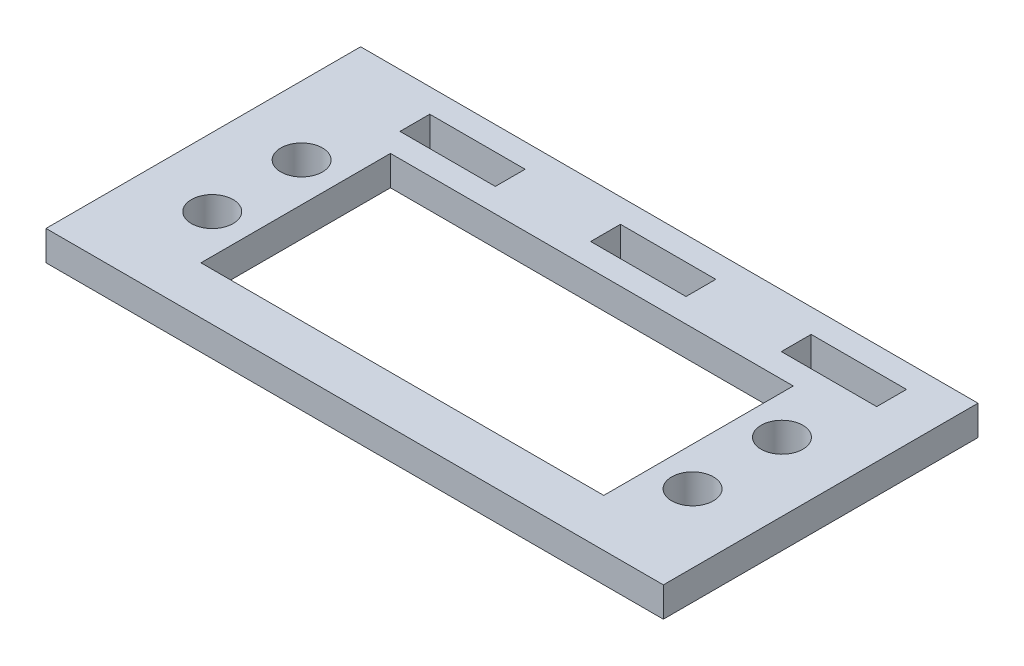
ISO-10303-21;
HEADER;
FILE_DESCRIPTION(('STEP AP214'),'2;1');
FILE_NAME('part.step','',(''),(''),'','','');
FILE_SCHEMA(('AUTOMOTIVE_DESIGN { 1 0 10303 214 1 1 1 1 }'));
ENDSEC;
DATA;
#1=APPLICATION_CONTEXT('core data for automotive mechanical design processes');
#2=APPLICATION_PROTOCOL_DEFINITION('international standard','automotive_design',2000,#1);
#3=PRODUCT_CONTEXT('',#1,'mechanical');
#4=PRODUCT('Part','Part','',(#3));
#5=PRODUCT_RELATED_PRODUCT_CATEGORY('part','',(#4));
#6=PRODUCT_DEFINITION_FORMATION('','',#4);
#7=PRODUCT_DEFINITION_CONTEXT('part definition',#1,'design');
#8=PRODUCT_DEFINITION('design','',#6,#7);
#9=PRODUCT_DEFINITION_SHAPE('','',#8);
#10=(LENGTH_UNIT() NAMED_UNIT(*) SI_UNIT(.MILLI.,.METRE.));
#11=(NAMED_UNIT(*) PLANE_ANGLE_UNIT() SI_UNIT($,.RADIAN.));
#12=(NAMED_UNIT(*) SI_UNIT($,.STERADIAN.) SOLID_ANGLE_UNIT());
#13=UNCERTAINTY_MEASURE_WITH_UNIT(LENGTH_MEASURE(1.E-05),#10,'distance_accuracy_value','');
#14=(GEOMETRIC_REPRESENTATION_CONTEXT(3) GLOBAL_UNCERTAINTY_ASSIGNED_CONTEXT((#13)) GLOBAL_UNIT_ASSIGNED_CONTEXT((#10,
#11,#12)) REPRESENTATION_CONTEXT('',''));
#15=CARTESIAN_POINT('',(0.,0.,0.));
#16=DIRECTION('',(0.,0.,1.));
#17=DIRECTION('',(1.,0.,0.));
#18=AXIS2_PLACEMENT_3D('',#15,#16,#17);
#19=CARTESIAN_POINT('',(32.893,3.175,15.1765));
#20=DIRECTION('',(0.,-1.,0.));
#21=DIRECTION('',(0.,0.,-1.));
#22=AXIS2_PLACEMENT_3D('',#19,#20,#21);
#23=PLANE('',#22);
#24=DIRECTION('',(0.,0.,1.));
#25=VECTOR('',#24,1.);
#26=CARTESIAN_POINT('',(-22.987,3.175,-15.8114999999997));
#27=LINE('',#26,#25);
#28=CARTESIAN_POINT('',(-22.987,3.175,-15.8114999999997));
#29=VERTEX_POINT('',#28);
#30=CARTESIAN_POINT('',(-22.987,3.175,-12.6364999999997));
#31=VERTEX_POINT('',#30);
#32=EDGE_CURVE('E211',#29,#31,#27,.T.);
#33=ORIENTED_EDGE('',*,*,#32,.F.);
#34=DIRECTION('',(-1.,0.,0.));
#35=VECTOR('',#34,1.);
#36=CARTESIAN_POINT('',(-12.827,3.175,-15.8114999999997));
#37=LINE('',#36,#35);
#38=CARTESIAN_POINT('',(-12.827,3.175,-15.8114999999997));
#39=VERTEX_POINT('',#38);
#40=EDGE_CURVE('E219',#39,#29,#37,.T.);
#41=ORIENTED_EDGE('',*,*,#40,.F.);
#42=DIRECTION('',(0.,0.,-1.));
#43=VECTOR('',#42,1.);
#44=CARTESIAN_POINT('',(-12.827,3.175,-15.8114999999997));
#45=LINE('',#44,#43);
#46=CARTESIAN_POINT('',(-12.827,3.175,-12.6364999999997));
#47=VERTEX_POINT('',#46);
#48=EDGE_CURVE('E216',#47,#39,#45,.T.);
#49=ORIENTED_EDGE('',*,*,#48,.F.);
#50=DIRECTION('',(1.,0.,0.));
#51=VECTOR('',#50,1.);
#52=CARTESIAN_POINT('',(-12.827,3.175,-12.6364999999997));
#53=LINE('',#52,#51);
#54=EDGE_CURVE('E213',#31,#47,#53,.T.);
#55=ORIENTED_EDGE('',*,*,#54,.F.);
#56=EDGE_LOOP('',(#33,#41,#49,#55));
#57=FACE_BOUND('',#56,.T.);
#58=DIRECTION('',(0.,0.,1.));
#59=VECTOR('',#58,1.);
#60=CARTESIAN_POINT('',(17.653,3.175,-15.8115));
#61=LINE('',#60,#59);
#62=CARTESIAN_POINT('',(17.653,3.175,-15.8115));
#63=VERTEX_POINT('',#62);
#64=CARTESIAN_POINT('',(17.653,3.175,-12.6365));
#65=VERTEX_POINT('',#64);
#66=EDGE_CURVE('E273',#63,#65,#61,.T.);
#67=ORIENTED_EDGE('',*,*,#66,.F.);
#68=DIRECTION('',(-1.,0.,0.));
#69=VECTOR('',#68,1.);
#70=CARTESIAN_POINT('',(27.813,3.175,-15.8115));
#71=LINE('',#70,#69);
#72=CARTESIAN_POINT('',(27.813,3.175,-15.8115));
#73=VERTEX_POINT('',#72);
#74=EDGE_CURVE('E281',#73,#63,#71,.T.);
#75=ORIENTED_EDGE('',*,*,#74,.F.);
#76=DIRECTION('',(0.,0.,-1.));
#77=VECTOR('',#76,1.);
#78=CARTESIAN_POINT('',(27.813,3.175,-15.8115));
#79=LINE('',#78,#77);
#80=CARTESIAN_POINT('',(27.813,3.175,-12.6365));
#81=VERTEX_POINT('',#80);
#82=EDGE_CURVE('E278',#81,#73,#79,.T.);
#83=ORIENTED_EDGE('',*,*,#82,.F.);
#84=DIRECTION('',(1.,0.,0.));
#85=VECTOR('',#84,1.);
#86=CARTESIAN_POINT('',(27.813,3.175,-12.6365));
#87=LINE('',#86,#85);
#88=EDGE_CURVE('E275',#65,#81,#87,.T.);
#89=ORIENTED_EDGE('',*,*,#88,.F.);
#90=EDGE_LOOP('',(#67,#75,#83,#89));
#91=FACE_BOUND('',#90,.T.);
#92=DIRECTION('',(0.,0.,-1.));
#93=VECTOR('',#92,1.);
#94=CARTESIAN_POINT('',(32.893,3.175,-18.3515));
#95=LINE('',#94,#93);
#96=CARTESIAN_POINT('',(32.893,3.175,15.1765));
#97=VERTEX_POINT('',#96);
#98=CARTESIAN_POINT('',(32.893,3.175,-18.3515));
#99=VERTEX_POINT('',#98);
#100=EDGE_CURVE('E304',#97,#99,#95,.T.);
#101=ORIENTED_EDGE('',*,*,#100,.T.);
#102=DIRECTION('',(-1.,0.,0.));
#103=VECTOR('',#102,1.);
#104=CARTESIAN_POINT('',(32.893,3.175,-18.3515));
#105=LINE('',#104,#103);
#106=CARTESIAN_POINT('',(-32.893,3.175,-18.3515));
#107=VERTEX_POINT('',#106);
#108=EDGE_CURVE('E307',#99,#107,#105,.T.);
#109=ORIENTED_EDGE('',*,*,#108,.T.);
#110=DIRECTION('',(0.,0.,1.));
#111=VECTOR('',#110,1.);
#112=CARTESIAN_POINT('',(-32.893,3.175,-18.3515));
#113=LINE('',#112,#111);
#114=CARTESIAN_POINT('',(-32.893,3.175,15.1765));
#115=VERTEX_POINT('',#114);
#116=EDGE_CURVE('E310',#107,#115,#113,.T.);
#117=ORIENTED_EDGE('',*,*,#116,.T.);
#118=DIRECTION('',(1.,0.,0.));
#119=VECTOR('',#118,1.);
#120=CARTESIAN_POINT('',(32.893,3.175,15.1765));
#121=LINE('',#120,#119);
#122=EDGE_CURVE('E312',#115,#97,#121,.T.);
#123=ORIENTED_EDGE('',*,*,#122,.T.);
#124=EDGE_LOOP('',(#101,#109,#117,#123));
#125=FACE_BOUND('',#124,.T.);
#126=DIRECTION('',(0.,0.,1.));
#127=VECTOR('',#126,1.);
#128=CARTESIAN_POINT('',(-2.66700000000001,3.175,-15.8114999999999));
#129=LINE('',#128,#127);
#130=CARTESIAN_POINT('',(-2.66700000000001,3.175,-15.8114999999999));
#131=VERTEX_POINT('',#130);
#132=CARTESIAN_POINT('',(-2.66700000000001,3.175,-12.6364999999999));
#133=VERTEX_POINT('',#132);
#134=EDGE_CURVE('E242',#131,#133,#129,.T.);
#135=ORIENTED_EDGE('',*,*,#134,.F.);
#136=DIRECTION('',(-1.,0.,0.));
#137=VECTOR('',#136,1.);
#138=CARTESIAN_POINT('',(7.493,3.175,-15.8114999999999));
#139=LINE('',#138,#137);
#140=CARTESIAN_POINT('',(7.49299999999999,3.175,-15.8114999999999));
#141=VERTEX_POINT('',#140);
#142=EDGE_CURVE('E250',#141,#131,#139,.T.);
#143=ORIENTED_EDGE('',*,*,#142,.F.);
#144=DIRECTION('',(0.,0.,-1.));
#145=VECTOR('',#144,1.);
#146=CARTESIAN_POINT('',(7.493,3.175,-15.8114999999999));
#147=LINE('',#146,#145);
#148=CARTESIAN_POINT('',(7.493,3.175,-12.6364999999999));
#149=VERTEX_POINT('',#148);
#150=EDGE_CURVE('E247',#149,#141,#147,.T.);
#151=ORIENTED_EDGE('',*,*,#150,.F.);
#152=DIRECTION('',(1.,0.,0.));
#153=VECTOR('',#152,1.);
#154=CARTESIAN_POINT('',(7.493,3.175,-12.6364999999999));
#155=LINE('',#154,#153);
#156=EDGE_CURVE('E244',#133,#149,#155,.T.);
#157=ORIENTED_EDGE('',*,*,#156,.F.);
#158=EDGE_LOOP('',(#135,#143,#151,#157));
#159=FACE_BOUND('',#158,.T.);
#160=DIRECTION('',(0.,0.,-1.));
#161=VECTOR('',#160,1.);
#162=CARTESIAN_POINT('',(21.463,3.175,10.0965));
#163=LINE('',#162,#161);
#164=CARTESIAN_POINT('',(21.463,3.175,10.0965));
#165=VERTEX_POINT('',#164);
#166=CARTESIAN_POINT('',(21.463,3.175,-10.0965));
#167=VERTEX_POINT('',#166);
#168=EDGE_CURVE('E172',#165,#167,#163,.T.);
#169=ORIENTED_EDGE('',*,*,#168,.F.);
#170=DIRECTION('',(1.,0.,0.));
#171=VECTOR('',#170,1.);
#172=CARTESIAN_POINT('',(-21.463,3.175,10.0965));
#173=LINE('',#172,#171);
#174=CARTESIAN_POINT('',(-21.463,3.175,10.0965));
#175=VERTEX_POINT('',#174);
#176=EDGE_CURVE('E195',#175,#165,#173,.T.);
#177=ORIENTED_EDGE('',*,*,#176,.F.);
#178=DIRECTION('',(0.,0.,1.));
#179=VECTOR('',#178,1.);
#180=CARTESIAN_POINT('',(-21.463,3.175,10.0965));
#181=LINE('',#180,#179);
#182=CARTESIAN_POINT('',(-21.463,3.175,-10.0965));
#183=VERTEX_POINT('',#182);
#184=EDGE_CURVE('E193',#183,#175,#181,.T.);
#185=ORIENTED_EDGE('',*,*,#184,.F.);
#186=DIRECTION('',(-1.,0.,0.));
#187=VECTOR('',#186,1.);
#188=CARTESIAN_POINT('',(-21.463,3.175,-10.0965));
#189=LINE('',#188,#187);
#190=EDGE_CURVE('E180',#167,#183,#189,.T.);
#191=ORIENTED_EDGE('',*,*,#190,.F.);
#192=EDGE_LOOP('',(#169,#177,#185,#191));
#193=FACE_BOUND('',#192,.T.);
#194=CARTESIAN_POINT('',(-25.5905,3.175,-4.7625));
#195=DIRECTION('',(0.,1.,0.));
#196=DIRECTION('',(0.,0.,1.));
#197=AXIS2_PLACEMENT_3D('',#194,#195,#196);
#198=CIRCLE('',#197,2.2225);
#199=CARTESIAN_POINT('',(-25.5905,3.175,-2.54));
#200=VERTEX_POINT('',#199);
#201=EDGE_CURVE('E201',#200,#200,#198,.T.);
#202=ORIENTED_EDGE('',*,*,#201,.F.);
#203=EDGE_LOOP('',(#202));
#204=FACE_BOUND('',#203,.T.);
#205=CARTESIAN_POINT('',(-25.5905,3.175,4.7625));
#206=DIRECTION('',(0.,1.,0.));
#207=DIRECTION('',(0.,0.,1.));
#208=AXIS2_PLACEMENT_3D('',#205,#206,#207);
#209=CIRCLE('',#208,2.2225);
#210=CARTESIAN_POINT('',(-25.5905,3.175,6.985));
#211=VERTEX_POINT('',#210);
#212=EDGE_CURVE('E478',#211,#211,#209,.T.);
#213=ORIENTED_EDGE('',*,*,#212,.F.);
#214=EDGE_LOOP('',(#213));
#215=FACE_BOUND('',#214,.T.);
#216=CARTESIAN_POINT('',(25.5905,3.175,-4.7625));
#217=DIRECTION('',(0.,1.,0.));
#218=DIRECTION('',(0.,0.,1.));
#219=AXIS2_PLACEMENT_3D('',#216,#217,#218);
#220=CIRCLE('',#219,2.2225);
#221=CARTESIAN_POINT('',(25.5905,3.175,-2.54));
#222=VERTEX_POINT('',#221);
#223=EDGE_CURVE('E472',#222,#222,#220,.T.);
#224=ORIENTED_EDGE('',*,*,#223,.F.);
#225=EDGE_LOOP('',(#224));
#226=FACE_BOUND('',#225,.T.);
#227=CARTESIAN_POINT('',(25.5905,3.175,4.7625));
#228=DIRECTION('',(0.,1.,0.));
#229=DIRECTION('',(0.,0.,1.));
#230=AXIS2_PLACEMENT_3D('',#227,#228,#229);
#231=CIRCLE('',#230,2.2225);
#232=CARTESIAN_POINT('',(25.5905,3.175,6.985));
#233=VERTEX_POINT('',#232);
#234=EDGE_CURVE('E463',#233,#233,#231,.T.);
#235=ORIENTED_EDGE('',*,*,#234,.F.);
#236=EDGE_LOOP('',(#235));
#237=FACE_BOUND('',#236,.T.);
#238=ADVANCED_FACE('F35',(#57,#91,#125,#159,#193,#204,#215,#226,#237),#23,.F.);
#239=CARTESIAN_POINT('',(32.893,0.,15.1765));
#240=DIRECTION('',(0.,-1.,0.));
#241=DIRECTION('',(0.,0.,-1.));
#242=AXIS2_PLACEMENT_3D('',#239,#240,#241);
#243=PLANE('',#242);
#244=CARTESIAN_POINT('',(25.5905,0.,-4.7625));
#245=DIRECTION('',(0.,1.,0.));
#246=DIRECTION('',(0.,0.,1.));
#247=AXIS2_PLACEMENT_3D('',#244,#245,#246);
#248=CIRCLE('',#247,2.2225);
#249=CARTESIAN_POINT('',(25.5905,0.,-2.54));
#250=VERTEX_POINT('',#249);
#251=EDGE_CURVE('E469',#250,#250,#248,.T.);
#252=ORIENTED_EDGE('',*,*,#251,.T.);
#253=EDGE_LOOP('',(#252));
#254=FACE_BOUND('',#253,.T.);
#255=CARTESIAN_POINT('',(-25.5905,0.,-4.7625));
#256=DIRECTION('',(0.,1.,0.));
#257=DIRECTION('',(0.,0.,1.));
#258=AXIS2_PLACEMENT_3D('',#255,#256,#257);
#259=CIRCLE('',#258,2.2225);
#260=CARTESIAN_POINT('',(-25.5905,0.,-2.54));
#261=VERTEX_POINT('',#260);
#262=EDGE_CURVE('E481',#261,#261,#259,.T.);
#263=ORIENTED_EDGE('',*,*,#262,.T.);
#264=EDGE_LOOP('',(#263));
#265=FACE_BOUND('',#264,.T.);
#266=DIRECTION('',(0.,0.,-1.));
#267=VECTOR('',#266,1.);
#268=CARTESIAN_POINT('',(32.893,0.,-18.3515));
#269=LINE('',#268,#267);
#270=CARTESIAN_POINT('',(32.893,0.,15.1765));
#271=VERTEX_POINT('',#270);
#272=CARTESIAN_POINT('',(32.893,0.,-18.3515));
#273=VERTEX_POINT('',#272);
#274=EDGE_CURVE('E303',#271,#273,#269,.T.);
#275=ORIENTED_EDGE('',*,*,#274,.F.);
#276=DIRECTION('',(1.,0.,0.));
#277=VECTOR('',#276,1.);
#278=CARTESIAN_POINT('',(32.893,0.,15.1765));
#279=LINE('',#278,#277);
#280=CARTESIAN_POINT('',(-32.893,0.,15.1765));
#281=VERTEX_POINT('',#280);
#282=EDGE_CURVE('E308',#281,#271,#279,.T.);
#283=ORIENTED_EDGE('',*,*,#282,.F.);
#284=DIRECTION('',(0.,0.,1.));
#285=VECTOR('',#284,1.);
#286=CARTESIAN_POINT('',(-32.893,0.,-18.3515));
#287=LINE('',#286,#285);
#288=CARTESIAN_POINT('',(-32.893,0.,-18.3515));
#289=VERTEX_POINT('',#288);
#290=EDGE_CURVE('E319',#289,#281,#287,.T.);
#291=ORIENTED_EDGE('',*,*,#290,.F.);
#292=DIRECTION('',(-1.,0.,0.));
#293=VECTOR('',#292,1.);
#294=CARTESIAN_POINT('',(32.893,0.,-18.3515));
#295=LINE('',#294,#293);
#296=EDGE_CURVE('E317',#273,#289,#295,.T.);
#297=ORIENTED_EDGE('',*,*,#296,.F.);
#298=EDGE_LOOP('',(#275,#283,#291,#297));
#299=FACE_BOUND('',#298,.T.);
#300=DIRECTION('',(-1.,0.,0.));
#301=VECTOR('',#300,1.);
#302=CARTESIAN_POINT('',(27.813,0.,-15.8115));
#303=LINE('',#302,#301);
#304=CARTESIAN_POINT('',(27.813,0.,-15.8115));
#305=VERTEX_POINT('',#304);
#306=CARTESIAN_POINT('',(17.653,0.,-15.8115));
#307=VERTEX_POINT('',#306);
#308=EDGE_CURVE('E276',#305,#307,#303,.T.);
#309=ORIENTED_EDGE('',*,*,#308,.T.);
#310=DIRECTION('',(0.,0.,1.));
#311=VECTOR('',#310,1.);
#312=CARTESIAN_POINT('',(17.653,0.,-15.8115));
#313=LINE('',#312,#311);
#314=CARTESIAN_POINT('',(17.653,0.,-12.6365));
#315=VERTEX_POINT('',#314);
#316=EDGE_CURVE('E272',#307,#315,#313,.T.);
#317=ORIENTED_EDGE('',*,*,#316,.T.);
#318=DIRECTION('',(1.,0.,0.));
#319=VECTOR('',#318,1.);
#320=CARTESIAN_POINT('',(27.813,0.,-12.6365));
#321=LINE('',#320,#319);
#322=CARTESIAN_POINT('',(27.813,0.,-12.6365));
#323=VERTEX_POINT('',#322);
#324=EDGE_CURVE('E286',#315,#323,#321,.T.);
#325=ORIENTED_EDGE('',*,*,#324,.T.);
#326=DIRECTION('',(0.,0.,-1.));
#327=VECTOR('',#326,1.);
#328=CARTESIAN_POINT('',(27.813,0.,-15.8115));
#329=LINE('',#328,#327);
#330=EDGE_CURVE('E289',#323,#305,#329,.T.);
#331=ORIENTED_EDGE('',*,*,#330,.T.);
#332=EDGE_LOOP('',(#309,#317,#325,#331));
#333=FACE_BOUND('',#332,.T.);
#334=DIRECTION('',(-1.,0.,0.));
#335=VECTOR('',#334,1.);
#336=CARTESIAN_POINT('',(7.493,0.,-15.8114999999999));
#337=LINE('',#336,#335);
#338=CARTESIAN_POINT('',(7.493,0.,-15.8114999999999));
#339=VERTEX_POINT('',#338);
#340=CARTESIAN_POINT('',(-2.667,0.,-15.8114999999999));
#341=VERTEX_POINT('',#340);
#342=EDGE_CURVE('E245',#339,#341,#337,.T.);
#343=ORIENTED_EDGE('',*,*,#342,.T.);
#344=DIRECTION('',(0.,0.,1.));
#345=VECTOR('',#344,1.);
#346=CARTESIAN_POINT('',(-2.66700000000001,0.,-15.8114999999999));
#347=LINE('',#346,#345);
#348=CARTESIAN_POINT('',(-2.66700000000001,0.,-12.6364999999999));
#349=VERTEX_POINT('',#348);
#350=EDGE_CURVE('E241',#341,#349,#347,.T.);
#351=ORIENTED_EDGE('',*,*,#350,.T.);
#352=DIRECTION('',(1.,0.,0.));
#353=VECTOR('',#352,1.);
#354=CARTESIAN_POINT('',(7.493,0.,-12.6364999999999));
#355=LINE('',#354,#353);
#356=CARTESIAN_POINT('',(7.493,0.,-12.6364999999999));
#357=VERTEX_POINT('',#356);
#358=EDGE_CURVE('E255',#349,#357,#355,.T.);
#359=ORIENTED_EDGE('',*,*,#358,.T.);
#360=DIRECTION('',(0.,0.,-1.));
#361=VECTOR('',#360,1.);
#362=CARTESIAN_POINT('',(7.493,0.,-15.8114999999999));
#363=LINE('',#362,#361);
#364=EDGE_CURVE('E258',#357,#339,#363,.T.);
#365=ORIENTED_EDGE('',*,*,#364,.T.);
#366=EDGE_LOOP('',(#343,#351,#359,#365));
#367=FACE_BOUND('',#366,.T.);
#368=DIRECTION('',(-1.,0.,0.));
#369=VECTOR('',#368,1.);
#370=CARTESIAN_POINT('',(-12.827,0.,-15.8114999999997));
#371=LINE('',#370,#369);
#372=CARTESIAN_POINT('',(-12.827,0.,-15.8114999999997));
#373=VERTEX_POINT('',#372);
#374=CARTESIAN_POINT('',(-22.987,0.,-15.8114999999997));
#375=VERTEX_POINT('',#374);
#376=EDGE_CURVE('E214',#373,#375,#371,.T.);
#377=ORIENTED_EDGE('',*,*,#376,.T.);
#378=DIRECTION('',(0.,0.,1.));
#379=VECTOR('',#378,1.);
#380=CARTESIAN_POINT('',(-22.987,0.,-15.8114999999997));
#381=LINE('',#380,#379);
#382=CARTESIAN_POINT('',(-22.987,0.,-12.6364999999997));
#383=VERTEX_POINT('',#382);
#384=EDGE_CURVE('E188',#375,#383,#381,.T.);
#385=ORIENTED_EDGE('',*,*,#384,.T.);
#386=DIRECTION('',(1.,0.,0.));
#387=VECTOR('',#386,1.);
#388=CARTESIAN_POINT('',(-12.827,0.,-12.6364999999997));
#389=LINE('',#388,#387);
#390=CARTESIAN_POINT('',(-12.827,0.,-12.6364999999997));
#391=VERTEX_POINT('',#390);
#392=EDGE_CURVE('E224',#383,#391,#389,.T.);
#393=ORIENTED_EDGE('',*,*,#392,.T.);
#394=DIRECTION('',(0.,0.,-1.));
#395=VECTOR('',#394,1.);
#396=CARTESIAN_POINT('',(-12.827,0.,-15.8114999999997));
#397=LINE('',#396,#395);
#398=EDGE_CURVE('E227',#391,#373,#397,.T.);
#399=ORIENTED_EDGE('',*,*,#398,.T.);
#400=EDGE_LOOP('',(#377,#385,#393,#399));
#401=FACE_BOUND('',#400,.T.);
#402=DIRECTION('',(1.,0.,0.));
#403=VECTOR('',#402,1.);
#404=CARTESIAN_POINT('',(-21.463,0.,10.0965));
#405=LINE('',#404,#403);
#406=CARTESIAN_POINT('',(-21.463,0.,10.0965));
#407=VERTEX_POINT('',#406);
#408=CARTESIAN_POINT('',(21.463,0.,10.0965));
#409=VERTEX_POINT('',#408);
#410=EDGE_CURVE('E181',#407,#409,#405,.T.);
#411=ORIENTED_EDGE('',*,*,#410,.T.);
#412=DIRECTION('',(0.,0.,-1.));
#413=VECTOR('',#412,1.);
#414=CARTESIAN_POINT('',(21.463,0.,10.0965));
#415=LINE('',#414,#413);
#416=CARTESIAN_POINT('',(21.463,0.,-10.0965));
#417=VERTEX_POINT('',#416);
#418=EDGE_CURVE('E58',#409,#417,#415,.T.);
#419=ORIENTED_EDGE('',*,*,#418,.T.);
#420=DIRECTION('',(-1.,0.,0.));
#421=VECTOR('',#420,1.);
#422=CARTESIAN_POINT('',(-21.463,0.,-10.0965));
#423=LINE('',#422,#421);
#424=CARTESIAN_POINT('',(-21.463,0.,-10.0965));
#425=VERTEX_POINT('',#424);
#426=EDGE_CURVE('E187',#417,#425,#423,.T.);
#427=ORIENTED_EDGE('',*,*,#426,.T.);
#428=DIRECTION('',(0.,0.,1.));
#429=VECTOR('',#428,1.);
#430=CARTESIAN_POINT('',(-21.463,0.,10.0965));
#431=LINE('',#430,#429);
#432=EDGE_CURVE('E203',#425,#407,#431,.T.);
#433=ORIENTED_EDGE('',*,*,#432,.T.);
#434=EDGE_LOOP('',(#411,#419,#427,#433));
#435=FACE_BOUND('',#434,.T.);
#436=CARTESIAN_POINT('',(-25.5905,0.,4.7625));
#437=DIRECTION('',(0.,1.,0.));
#438=DIRECTION('',(0.,0.,1.));
#439=AXIS2_PLACEMENT_3D('',#436,#437,#438);
#440=CIRCLE('',#439,2.2225);
#441=CARTESIAN_POINT('',(-25.5905,0.,6.985));
#442=VERTEX_POINT('',#441);
#443=EDGE_CURVE('E475',#442,#442,#440,.T.);
#444=ORIENTED_EDGE('',*,*,#443,.T.);
#445=EDGE_LOOP('',(#444));
#446=FACE_BOUND('',#445,.T.);
#447=CARTESIAN_POINT('',(25.5905,0.,4.7625));
#448=DIRECTION('',(0.,1.,0.));
#449=DIRECTION('',(0.,0.,1.));
#450=AXIS2_PLACEMENT_3D('',#447,#448,#449);
#451=CIRCLE('',#450,2.2225);
#452=CARTESIAN_POINT('',(25.5905,0.,6.985));
#453=VERTEX_POINT('',#452);
#454=EDGE_CURVE('E466',#453,#453,#451,.T.);
#455=ORIENTED_EDGE('',*,*,#454,.T.);
#456=EDGE_LOOP('',(#455));
#457=FACE_BOUND('',#456,.T.);
#458=ADVANCED_FACE('F337',(#254,#265,#299,#333,#367,#401,#435,#446,#457),#243,.T.);
#459=CARTESIAN_POINT('',(32.893,3.175,-18.3515));
#460=DIRECTION('',(-1.,0.,0.));
#461=DIRECTION('',(0.,0.,1.));
#462=AXIS2_PLACEMENT_3D('',#459,#460,#461);
#463=PLANE('',#462);
#464=ORIENTED_EDGE('',*,*,#274,.T.);
#465=DIRECTION('',(0.,-1.,0.));
#466=VECTOR('',#465,1.);
#467=CARTESIAN_POINT('',(32.893,3.175,-18.3515));
#468=LINE('',#467,#466);
#469=EDGE_CURVE('E11',#99,#273,#468,.T.);
#470=ORIENTED_EDGE('',*,*,#469,.F.);
#471=ORIENTED_EDGE('',*,*,#100,.F.);
#472=DIRECTION('',(0.,-1.,0.));
#473=VECTOR('',#472,1.);
#474=CARTESIAN_POINT('',(32.893,3.175,15.1765));
#475=LINE('',#474,#473);
#476=EDGE_CURVE('E314',#97,#271,#475,.T.);
#477=ORIENTED_EDGE('',*,*,#476,.T.);
#478=EDGE_LOOP('',(#464,#470,#471,#477));
#479=FACE_BOUND('',#478,.T.);
#480=ADVANCED_FACE('F37',(#479),#463,.F.);
#481=CARTESIAN_POINT('',(32.893,3.175,-18.3515));
#482=DIRECTION('',(0.,0.,1.));
#483=DIRECTION('',(1.,0.,0.));
#484=AXIS2_PLACEMENT_3D('',#481,#482,#483);
#485=PLANE('',#484);
#486=ORIENTED_EDGE('',*,*,#296,.T.);
#487=DIRECTION('',(0.,-1.,0.));
#488=VECTOR('',#487,1.);
#489=CARTESIAN_POINT('',(-32.893,3.175,-18.3515));
#490=LINE('',#489,#488);
#491=EDGE_CURVE('E43',#107,#289,#490,.T.);
#492=ORIENTED_EDGE('',*,*,#491,.F.);
#493=ORIENTED_EDGE('',*,*,#108,.F.);
#494=ORIENTED_EDGE('',*,*,#469,.T.);
#495=EDGE_LOOP('',(#486,#492,#493,#494));
#496=FACE_BOUND('',#495,.T.);
#497=ADVANCED_FACE('F348',(#496),#485,.F.);
#498=CARTESIAN_POINT('',(-32.893,3.175,-18.3515));
#499=DIRECTION('',(1.,0.,0.));
#500=DIRECTION('',(0.,0.,-1.));
#501=AXIS2_PLACEMENT_3D('',#498,#499,#500);
#502=PLANE('',#501);
#503=ORIENTED_EDGE('',*,*,#290,.T.);
#504=DIRECTION('',(0.,-1.,0.));
#505=VECTOR('',#504,1.);
#506=CARTESIAN_POINT('',(-32.893,3.175,15.1765));
#507=LINE('',#506,#505);
#508=EDGE_CURVE('E324',#115,#281,#507,.T.);
#509=ORIENTED_EDGE('',*,*,#508,.F.);
#510=ORIENTED_EDGE('',*,*,#116,.F.);
#511=ORIENTED_EDGE('',*,*,#491,.T.);
#512=EDGE_LOOP('',(#503,#509,#510,#511));
#513=FACE_BOUND('',#512,.T.);
#514=ADVANCED_FACE('F331',(#513),#502,.F.);
#515=CARTESIAN_POINT('',(32.893,3.175,15.1765));
#516=DIRECTION('',(0.,0.,-1.));
#517=DIRECTION('',(-1.,0.,0.));
#518=AXIS2_PLACEMENT_3D('',#515,#516,#517);
#519=PLANE('',#518);
#520=ORIENTED_EDGE('',*,*,#282,.T.);
#521=ORIENTED_EDGE('',*,*,#476,.F.);
#522=ORIENTED_EDGE('',*,*,#122,.F.);
#523=ORIENTED_EDGE('',*,*,#508,.T.);
#524=EDGE_LOOP('',(#520,#521,#522,#523));
#525=FACE_BOUND('',#524,.T.);
#526=ADVANCED_FACE('F341',(#525),#519,.F.);
#527=CARTESIAN_POINT('',(17.653,3.175,-15.8115));
#528=DIRECTION('',(1.,0.,0.));
#529=DIRECTION('',(0.,0.,-1.));
#530=AXIS2_PLACEMENT_3D('',#527,#528,#529);
#531=PLANE('',#530);
#532=ORIENTED_EDGE('',*,*,#316,.F.);
#533=DIRECTION('',(0.,-1.,0.));
#534=VECTOR('',#533,1.);
#535=CARTESIAN_POINT('',(17.653,3.175,-15.8115));
#536=LINE('',#535,#534);
#537=EDGE_CURVE('E283',#63,#307,#536,.T.);
#538=ORIENTED_EDGE('',*,*,#537,.F.);
#539=ORIENTED_EDGE('',*,*,#66,.T.);
#540=DIRECTION('',(0.,-1.,0.));
#541=VECTOR('',#540,1.);
#542=CARTESIAN_POINT('',(17.653,3.175,-12.6365));
#543=LINE('',#542,#541);
#544=EDGE_CURVE('E300',#65,#315,#543,.T.);
#545=ORIENTED_EDGE('',*,*,#544,.T.);
#546=EDGE_LOOP('',(#532,#538,#539,#545));
#547=FACE_BOUND('',#546,.T.);
#548=ADVANCED_FACE('F366',(#547),#531,.T.);
#549=CARTESIAN_POINT('',(27.813,3.175,-12.6365));
#550=DIRECTION('',(0.,0.,-1.));
#551=DIRECTION('',(-1.,0.,0.));
#552=AXIS2_PLACEMENT_3D('',#549,#550,#551);
#553=PLANE('',#552);
#554=ORIENTED_EDGE('',*,*,#324,.F.);
#555=ORIENTED_EDGE('',*,*,#544,.F.);
#556=ORIENTED_EDGE('',*,*,#88,.T.);
#557=DIRECTION('',(0.,-1.,0.));
#558=VECTOR('',#557,1.);
#559=CARTESIAN_POINT('',(27.813,3.175,-12.6365));
#560=LINE('',#559,#558);
#561=EDGE_CURVE('E298',#81,#323,#560,.T.);
#562=ORIENTED_EDGE('',*,*,#561,.T.);
#563=EDGE_LOOP('',(#554,#555,#556,#562));
#564=FACE_BOUND('',#563,.T.);
#565=ADVANCED_FACE('F373',(#564),#553,.T.);
#566=CARTESIAN_POINT('',(27.813,3.175,-15.8115));
#567=DIRECTION('',(-1.,0.,0.));
#568=DIRECTION('',(0.,0.,1.));
#569=AXIS2_PLACEMENT_3D('',#566,#567,#568);
#570=PLANE('',#569);
#571=ORIENTED_EDGE('',*,*,#330,.F.);
#572=ORIENTED_EDGE('',*,*,#561,.F.);
#573=ORIENTED_EDGE('',*,*,#82,.T.);
#574=DIRECTION('',(0.,-1.,0.));
#575=VECTOR('',#574,1.);
#576=CARTESIAN_POINT('',(27.813,3.175,-15.8115));
#577=LINE('',#576,#575);
#578=EDGE_CURVE('E296',#73,#305,#577,.T.);
#579=ORIENTED_EDGE('',*,*,#578,.T.);
#580=EDGE_LOOP('',(#571,#572,#573,#579));
#581=FACE_BOUND('',#580,.T.);
#582=ADVANCED_FACE('F378',(#581),#570,.T.);
#583=CARTESIAN_POINT('',(27.813,3.175,-15.8115));
#584=DIRECTION('',(0.,0.,1.));
#585=DIRECTION('',(1.,0.,0.));
#586=AXIS2_PLACEMENT_3D('',#583,#584,#585);
#587=PLANE('',#586);
#588=ORIENTED_EDGE('',*,*,#308,.F.);
#589=ORIENTED_EDGE('',*,*,#578,.F.);
#590=ORIENTED_EDGE('',*,*,#74,.T.);
#591=ORIENTED_EDGE('',*,*,#537,.T.);
#592=EDGE_LOOP('',(#588,#589,#590,#591));
#593=FACE_BOUND('',#592,.T.);
#594=ADVANCED_FACE('F385',(#593),#587,.T.);
#595=CARTESIAN_POINT('',(-2.66700000000001,3.175,-15.8114999999999));
#596=DIRECTION('',(1.,0.,0.));
#597=DIRECTION('',(0.,0.,-1.));
#598=AXIS2_PLACEMENT_3D('',#595,#596,#597);
#599=PLANE('',#598);
#600=ORIENTED_EDGE('',*,*,#350,.F.);
#601=DIRECTION('',(0.,-1.,0.));
#602=VECTOR('',#601,1.);
#603=CARTESIAN_POINT('',(-2.66700000000001,3.175,-15.8114999999999));
#604=LINE('',#603,#602);
#605=EDGE_CURVE('E252',#131,#341,#604,.T.);
#606=ORIENTED_EDGE('',*,*,#605,.F.);
#607=ORIENTED_EDGE('',*,*,#134,.T.);
#608=DIRECTION('',(0.,-1.,0.));
#609=VECTOR('',#608,1.);
#610=CARTESIAN_POINT('',(-2.66700000000001,3.175,-12.6364999999999));
#611=LINE('',#610,#609);
#612=EDGE_CURVE('E269',#133,#349,#611,.T.);
#613=ORIENTED_EDGE('',*,*,#612,.T.);
#614=EDGE_LOOP('',(#600,#606,#607,#613));
#615=FACE_BOUND('',#614,.T.);
#616=ADVANCED_FACE('F398',(#615),#599,.T.);
#617=CARTESIAN_POINT('',(7.493,3.175,-12.6364999999999));
#618=DIRECTION('',(0.,0.,-1.));
#619=DIRECTION('',(-1.,0.,0.));
#620=AXIS2_PLACEMENT_3D('',#617,#618,#619);
#621=PLANE('',#620);
#622=ORIENTED_EDGE('',*,*,#358,.F.);
#623=ORIENTED_EDGE('',*,*,#612,.F.);
#624=ORIENTED_EDGE('',*,*,#156,.T.);
#625=DIRECTION('',(0.,-1.,0.));
#626=VECTOR('',#625,1.);
#627=CARTESIAN_POINT('',(7.493,3.175,-12.6364999999999));
#628=LINE('',#627,#626);
#629=EDGE_CURVE('E267',#149,#357,#628,.T.);
#630=ORIENTED_EDGE('',*,*,#629,.T.);
#631=EDGE_LOOP('',(#622,#623,#624,#630));
#632=FACE_BOUND('',#631,.T.);
#633=ADVANCED_FACE('F403',(#632),#621,.T.);
#634=CARTESIAN_POINT('',(7.493,3.175,-15.8114999999999));
#635=DIRECTION('',(-1.,0.,0.));
#636=DIRECTION('',(0.,0.,1.));
#637=AXIS2_PLACEMENT_3D('',#634,#635,#636);
#638=PLANE('',#637);
#639=ORIENTED_EDGE('',*,*,#364,.F.);
#640=ORIENTED_EDGE('',*,*,#629,.F.);
#641=ORIENTED_EDGE('',*,*,#150,.T.);
#642=DIRECTION('',(0.,-1.,0.));
#643=VECTOR('',#642,1.);
#644=CARTESIAN_POINT('',(7.493,3.175,-15.8114999999999));
#645=LINE('',#644,#643);
#646=EDGE_CURVE('E265',#141,#339,#645,.T.);
#647=ORIENTED_EDGE('',*,*,#646,.T.);
#648=EDGE_LOOP('',(#639,#640,#641,#647));
#649=FACE_BOUND('',#648,.T.);
#650=ADVANCED_FACE('F407',(#649),#638,.T.);
#651=CARTESIAN_POINT('',(7.493,3.175,-15.8114999999999));
#652=DIRECTION('',(0.,0.,1.));
#653=DIRECTION('',(1.,0.,0.));
#654=AXIS2_PLACEMENT_3D('',#651,#652,#653);
#655=PLANE('',#654);
#656=ORIENTED_EDGE('',*,*,#342,.F.);
#657=ORIENTED_EDGE('',*,*,#646,.F.);
#658=ORIENTED_EDGE('',*,*,#142,.T.);
#659=ORIENTED_EDGE('',*,*,#605,.T.);
#660=EDGE_LOOP('',(#656,#657,#658,#659));
#661=FACE_BOUND('',#660,.T.);
#662=ADVANCED_FACE('F411',(#661),#655,.T.);
#663=CARTESIAN_POINT('',(-22.987,3.175,-15.8114999999997));
#664=DIRECTION('',(1.,0.,0.));
#665=DIRECTION('',(0.,0.,-1.));
#666=AXIS2_PLACEMENT_3D('',#663,#664,#665);
#667=PLANE('',#666);
#668=ORIENTED_EDGE('',*,*,#384,.F.);
#669=DIRECTION('',(0.,-1.,0.));
#670=VECTOR('',#669,1.);
#671=CARTESIAN_POINT('',(-22.987,3.175,-15.8114999999997));
#672=LINE('',#671,#670);
#673=EDGE_CURVE('E221',#29,#375,#672,.T.);
#674=ORIENTED_EDGE('',*,*,#673,.F.);
#675=ORIENTED_EDGE('',*,*,#32,.T.);
#676=DIRECTION('',(0.,-1.,0.));
#677=VECTOR('',#676,1.);
#678=CARTESIAN_POINT('',(-22.987,3.175,-12.6364999999997));
#679=LINE('',#678,#677);
#680=EDGE_CURVE('E238',#31,#383,#679,.T.);
#681=ORIENTED_EDGE('',*,*,#680,.T.);
#682=EDGE_LOOP('',(#668,#674,#675,#681));
#683=FACE_BOUND('',#682,.T.);
#684=ADVANCED_FACE('F415',(#683),#667,.T.);
#685=CARTESIAN_POINT('',(-12.827,3.175,-12.6364999999997));
#686=DIRECTION('',(0.,0.,-1.));
#687=DIRECTION('',(-1.,0.,0.));
#688=AXIS2_PLACEMENT_3D('',#685,#686,#687);
#689=PLANE('',#688);
#690=ORIENTED_EDGE('',*,*,#392,.F.);
#691=ORIENTED_EDGE('',*,*,#680,.F.);
#692=ORIENTED_EDGE('',*,*,#54,.T.);
#693=DIRECTION('',(0.,-1.,0.));
#694=VECTOR('',#693,1.);
#695=CARTESIAN_POINT('',(-12.827,3.175,-12.6364999999997));
#696=LINE('',#695,#694);
#697=EDGE_CURVE('E236',#47,#391,#696,.T.);
#698=ORIENTED_EDGE('',*,*,#697,.T.);
#699=EDGE_LOOP('',(#690,#691,#692,#698));
#700=FACE_BOUND('',#699,.T.);
#701=ADVANCED_FACE('F419',(#700),#689,.T.);
#702=CARTESIAN_POINT('',(-12.827,3.175,-15.8114999999997));
#703=DIRECTION('',(-1.,0.,0.));
#704=DIRECTION('',(0.,0.,1.));
#705=AXIS2_PLACEMENT_3D('',#702,#703,#704);
#706=PLANE('',#705);
#707=ORIENTED_EDGE('',*,*,#398,.F.);
#708=ORIENTED_EDGE('',*,*,#697,.F.);
#709=ORIENTED_EDGE('',*,*,#48,.T.);
#710=DIRECTION('',(0.,-1.,0.));
#711=VECTOR('',#710,1.);
#712=CARTESIAN_POINT('',(-12.827,3.175,-15.8114999999997));
#713=LINE('',#712,#711);
#714=EDGE_CURVE('E234',#39,#373,#713,.T.);
#715=ORIENTED_EDGE('',*,*,#714,.T.);
#716=EDGE_LOOP('',(#707,#708,#709,#715));
#717=FACE_BOUND('',#716,.T.);
#718=ADVANCED_FACE('F423',(#717),#706,.T.);
#719=CARTESIAN_POINT('',(-12.827,3.175,-15.8114999999997));
#720=DIRECTION('',(0.,0.,1.));
#721=DIRECTION('',(1.,0.,0.));
#722=AXIS2_PLACEMENT_3D('',#719,#720,#721);
#723=PLANE('',#722);
#724=ORIENTED_EDGE('',*,*,#376,.F.);
#725=ORIENTED_EDGE('',*,*,#714,.F.);
#726=ORIENTED_EDGE('',*,*,#40,.T.);
#727=ORIENTED_EDGE('',*,*,#673,.T.);
#728=EDGE_LOOP('',(#724,#725,#726,#727));
#729=FACE_BOUND('',#728,.T.);
#730=ADVANCED_FACE('F427',(#729),#723,.T.);
#731=CARTESIAN_POINT('',(21.463,3.175,10.0965));
#732=DIRECTION('',(-1.,0.,0.));
#733=DIRECTION('',(0.,0.,1.));
#734=AXIS2_PLACEMENT_3D('',#731,#732,#733);
#735=PLANE('',#734);
#736=ORIENTED_EDGE('',*,*,#418,.F.);
#737=DIRECTION('',(0.,-1.,0.));
#738=VECTOR('',#737,1.);
#739=CARTESIAN_POINT('',(21.463,3.175,10.0965));
#740=LINE('',#739,#738);
#741=EDGE_CURVE('E176',#165,#409,#740,.T.);
#742=ORIENTED_EDGE('',*,*,#741,.F.);
#743=ORIENTED_EDGE('',*,*,#168,.T.);
#744=DIRECTION('',(0.,-1.,0.));
#745=VECTOR('',#744,1.);
#746=CARTESIAN_POINT('',(21.463,3.175,-10.0965));
#747=LINE('',#746,#745);
#748=EDGE_CURVE('E175',#167,#417,#747,.T.);
#749=ORIENTED_EDGE('',*,*,#748,.T.);
#750=EDGE_LOOP('',(#736,#742,#743,#749));
#751=FACE_BOUND('',#750,.T.);
#752=ADVANCED_FACE('F174',(#751),#735,.T.);
#753=CARTESIAN_POINT('',(-21.463,3.175,-10.0965));
#754=DIRECTION('',(0.,0.,1.));
#755=DIRECTION('',(1.,0.,0.));
#756=AXIS2_PLACEMENT_3D('',#753,#754,#755);
#757=PLANE('',#756);
#758=ORIENTED_EDGE('',*,*,#426,.F.);
#759=ORIENTED_EDGE('',*,*,#748,.F.);
#760=ORIENTED_EDGE('',*,*,#190,.T.);
#761=DIRECTION('',(0.,-1.,0.));
#762=VECTOR('',#761,1.);
#763=CARTESIAN_POINT('',(-21.463,3.175,-10.0965));
#764=LINE('',#763,#762);
#765=EDGE_CURVE('E189',#183,#425,#764,.T.);
#766=ORIENTED_EDGE('',*,*,#765,.T.);
#767=EDGE_LOOP('',(#758,#759,#760,#766));
#768=FACE_BOUND('',#767,.T.);
#769=ADVANCED_FACE('F184',(#768),#757,.T.);
#770=CARTESIAN_POINT('',(-21.463,3.175,10.0965));
#771=DIRECTION('',(1.,0.,0.));
#772=DIRECTION('',(0.,0.,-1.));
#773=AXIS2_PLACEMENT_3D('',#770,#771,#772);
#774=PLANE('',#773);
#775=ORIENTED_EDGE('',*,*,#432,.F.);
#776=ORIENTED_EDGE('',*,*,#765,.F.);
#777=ORIENTED_EDGE('',*,*,#184,.T.);
#778=DIRECTION('',(0.,-1.,0.));
#779=VECTOR('',#778,1.);
#780=CARTESIAN_POINT('',(-21.463,3.175,10.0965));
#781=LINE('',#780,#779);
#782=EDGE_CURVE('E50',#175,#407,#781,.T.);
#783=ORIENTED_EDGE('',*,*,#782,.T.);
#784=EDGE_LOOP('',(#775,#776,#777,#783));
#785=FACE_BOUND('',#784,.T.);
#786=ADVANCED_FACE('F436',(#785),#774,.T.);
#787=CARTESIAN_POINT('',(-21.463,3.175,10.0965));
#788=DIRECTION('',(0.,0.,-1.));
#789=DIRECTION('',(-1.,0.,0.));
#790=AXIS2_PLACEMENT_3D('',#787,#788,#789);
#791=PLANE('',#790);
#792=ORIENTED_EDGE('',*,*,#410,.F.);
#793=ORIENTED_EDGE('',*,*,#782,.F.);
#794=ORIENTED_EDGE('',*,*,#176,.T.);
#795=ORIENTED_EDGE('',*,*,#741,.T.);
#796=EDGE_LOOP('',(#792,#793,#794,#795));
#797=FACE_BOUND('',#796,.T.);
#798=ADVANCED_FACE('F439',(#797),#791,.T.);
#799=CARTESIAN_POINT('',(-25.5905,3.175,-4.7625));
#800=DIRECTION('',(0.,-1.,0.));
#801=DIRECTION('',(0.,0.,-1.));
#802=AXIS2_PLACEMENT_3D('',#799,#800,#801);
#803=CYLINDRICAL_SURFACE('',#802,2.2225);
#804=ORIENTED_EDGE('',*,*,#201,.T.);
#805=EDGE_LOOP('',(#804));
#806=FACE_BOUND('',#805,.T.);
#807=ORIENTED_EDGE('',*,*,#262,.F.);
#808=EDGE_LOOP('',(#807));
#809=FACE_BOUND('',#808,.T.);
#810=ADVANCED_FACE('F443',(#806,#809),#803,.F.);
#811=CARTESIAN_POINT('',(-25.5905,3.175,4.7625));
#812=DIRECTION('',(0.,-1.,0.));
#813=DIRECTION('',(0.,0.,-1.));
#814=AXIS2_PLACEMENT_3D('',#811,#812,#813);
#815=CYLINDRICAL_SURFACE('',#814,2.2225);
#816=ORIENTED_EDGE('',*,*,#212,.T.);
#817=EDGE_LOOP('',(#816));
#818=FACE_BOUND('',#817,.T.);
#819=ORIENTED_EDGE('',*,*,#443,.F.);
#820=EDGE_LOOP('',(#819));
#821=FACE_BOUND('',#820,.T.);
#822=ADVANCED_FACE('F446',(#818,#821),#815,.F.);
#823=CARTESIAN_POINT('',(25.5905,3.175,-4.7625));
#824=DIRECTION('',(0.,-1.,0.));
#825=DIRECTION('',(0.,0.,-1.));
#826=AXIS2_PLACEMENT_3D('',#823,#824,#825);
#827=CYLINDRICAL_SURFACE('',#826,2.2225);
#828=ORIENTED_EDGE('',*,*,#223,.T.);
#829=EDGE_LOOP('',(#828));
#830=FACE_BOUND('',#829,.T.);
#831=ORIENTED_EDGE('',*,*,#251,.F.);
#832=EDGE_LOOP('',(#831));
#833=FACE_BOUND('',#832,.T.);
#834=ADVANCED_FACE('F450',(#830,#833),#827,.F.);
#835=CARTESIAN_POINT('',(25.5905,3.175,4.7625));
#836=DIRECTION('',(0.,-1.,0.));
#837=DIRECTION('',(0.,0.,-1.));
#838=AXIS2_PLACEMENT_3D('',#835,#836,#837);
#839=CYLINDRICAL_SURFACE('',#838,2.2225);
#840=ORIENTED_EDGE('',*,*,#234,.T.);
#841=EDGE_LOOP('',(#840));
#842=FACE_BOUND('',#841,.T.);
#843=ORIENTED_EDGE('',*,*,#454,.F.);
#844=EDGE_LOOP('',(#843));
#845=FACE_BOUND('',#844,.T.);
#846=ADVANCED_FACE('F454',(#842,#845),#839,.F.);
#847=CLOSED_SHELL('',(#238,#458,#480,#497,#514,#526,#548,#565,#582,#594,#616,#633,#650,#662,
#684,#701,#718,#730,#752,#769,#786,#798,#810,#822,#834,#846));
#848=MANIFOLD_SOLID_BREP('B2',#847);
#849=ADVANCED_BREP_SHAPE_REPRESENTATION('',(#18,#848),#14);
#850=SHAPE_DEFINITION_REPRESENTATION(#9,#849);
ENDSEC;
END-ISO-10303-21;
